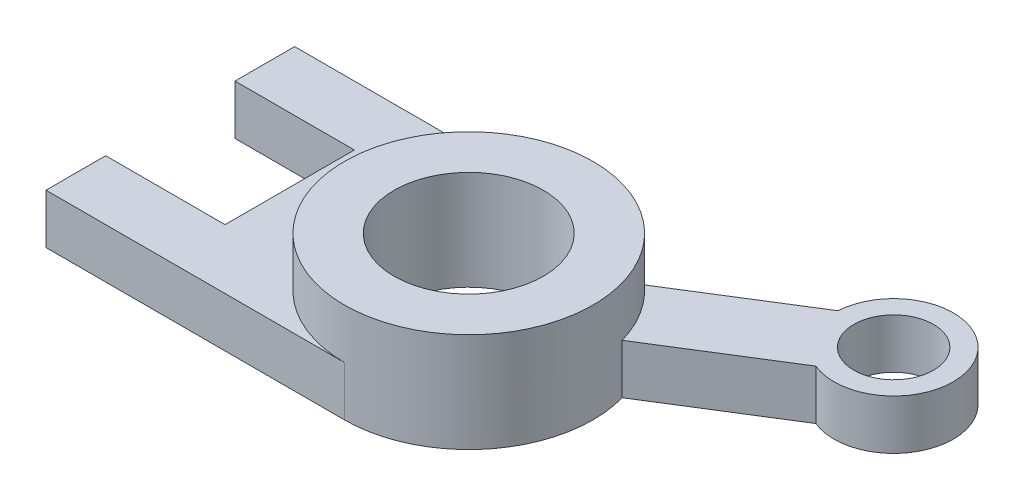
ISO-10303-21;
HEADER;
FILE_DESCRIPTION(('STEP AP214'),'2;1');
FILE_NAME('part.step','',(''),(''),'','','');
FILE_SCHEMA(('AUTOMOTIVE_DESIGN { 1 0 10303 214 1 1 1 1 }'));
ENDSEC;
DATA;
#1=APPLICATION_CONTEXT('core data for automotive mechanical design processes');
#2=APPLICATION_PROTOCOL_DEFINITION('international standard','automotive_design',2000,#1);
#3=PRODUCT_CONTEXT('',#1,'mechanical');
#4=PRODUCT('Part','Part','',(#3));
#5=PRODUCT_RELATED_PRODUCT_CATEGORY('part','',(#4));
#6=PRODUCT_DEFINITION_FORMATION('','',#4);
#7=PRODUCT_DEFINITION_CONTEXT('part definition',#1,'design');
#8=PRODUCT_DEFINITION('design','',#6,#7);
#9=PRODUCT_DEFINITION_SHAPE('','',#8);
#10=(LENGTH_UNIT() NAMED_UNIT(*) SI_UNIT(.MILLI.,.METRE.));
#11=(NAMED_UNIT(*) PLANE_ANGLE_UNIT() SI_UNIT($,.RADIAN.));
#12=(NAMED_UNIT(*) SI_UNIT($,.STERADIAN.) SOLID_ANGLE_UNIT());
#13=UNCERTAINTY_MEASURE_WITH_UNIT(LENGTH_MEASURE(1.E-05),#10,'distance_accuracy_value','');
#14=(GEOMETRIC_REPRESENTATION_CONTEXT(3) GLOBAL_UNCERTAINTY_ASSIGNED_CONTEXT((#13)) GLOBAL_UNIT_ASSIGNED_CONTEXT((#10,
#11,#12)) REPRESENTATION_CONTEXT('',''));
#15=CARTESIAN_POINT('',(0.,0.,0.));
#16=DIRECTION('',(0.,0.,1.));
#17=DIRECTION('',(1.,0.,0.));
#18=AXIS2_PLACEMENT_3D('',#15,#16,#17);
#19=CARTESIAN_POINT('',(0.,5.,0.));
#20=DIRECTION('',(0.,1.,0.));
#21=DIRECTION('',(0.,0.,1.));
#22=AXIS2_PLACEMENT_3D('',#19,#20,#21);
#23=PLANE('',#22);
#24=CARTESIAN_POINT('',(0.,5.,0.));
#25=DIRECTION('',(0.,1.,0.));
#26=DIRECTION('',(0.,0.,1.));
#27=AXIS2_PLACEMENT_3D('',#24,#25,#26);
#28=CIRCLE('',#27,12.4999999999972);
#29=CARTESIAN_POINT('',(12.0312945786778,5.,-3.39086283426413));
#30=VERTEX_POINT('',#29);
#31=CARTESIAN_POINT('',(8.32185972905463,5.,-9.32719950734393));
#32=VERTEX_POINT('',#31);
#33=EDGE_CURVE('E11',#30,#32,#28,.T.);
#34=ORIENTED_EDGE('',*,*,#33,.F.);
#35=DIRECTION('',(0.84804809615557,0.,-0.529919264234575));
#36=VECTOR('',#35,1.);
#37=CARTESIAN_POINT('',(12.0312945786778,5.,-3.39086283426413));
#38=LINE('',#37,#36);
#39=CARTESIAN_POINT('',(24.0113332117606,5.,-10.8768218107942));
#40=VERTEX_POINT('',#39);
#41=EDGE_CURVE('E211',#30,#40,#38,.T.);
#42=ORIENTED_EDGE('',*,*,#41,.T.);
#43=CARTESIAN_POINT('',(26.289490980841,5.,-16.4274971912538));
#44=DIRECTION('',(0.,1.,0.));
#45=DIRECTION('',(0.,0.,1.));
#46=AXIS2_PLACEMENT_3D('',#43,#44,#45);
#47=CIRCLE('',#46,6.00000000000514);
#48=CARTESIAN_POINT('',(20.3018983621457,5.,-16.8131584838504));
#49=VERTEX_POINT('',#48);
#50=EDGE_CURVE('E268',#40,#49,#47,.T.);
#51=ORIENTED_EDGE('',*,*,#50,.T.);
#52=DIRECTION('',(-0.848048096156426,0.,0.529919264233206));
#53=VECTOR('',#52,1.);
#54=CARTESIAN_POINT('',(8.32185972905084,5.,-9.32719950733968));
#55=LINE('',#54,#53);
#56=EDGE_CURVE('E271',#49,#32,#55,.T.);
#57=ORIENTED_EDGE('',*,*,#56,.T.);
#58=EDGE_LOOP('',(#34,#42,#51,#57));
#59=FACE_BOUND('',#58,.T.);
#60=CARTESIAN_POINT('',(26.2894909808363,5.,-16.4274971912541));
#61=DIRECTION('',(0.,1.,0.));
#62=DIRECTION('',(0.,0.,1.));
#63=AXIS2_PLACEMENT_3D('',#60,#61,#62);
#64=CIRCLE('',#63,4.00000000000514);
#65=CARTESIAN_POINT('',(26.2894909808363,5.,-12.427497191249));
#66=VERTEX_POINT('',#65);
#67=EDGE_CURVE('E181',#66,#66,#64,.T.);
#68=ORIENTED_EDGE('',*,*,#67,.F.);
#69=EDGE_LOOP('',(#68));
#70=FACE_BOUND('',#69,.T.);
#71=ADVANCED_FACE('F43',(#59,#70),#23,.T.);
#72=CARTESIAN_POINT('',(12.0312945786778,5.,-3.39086283426413));
#73=DIRECTION('',(-0.529919264234575,0.,-0.848048096155569));
#74=DIRECTION('',(-0.84804809615557,0.,0.529919264234576));
#75=AXIS2_PLACEMENT_3D('',#72,#73,#74);
#76=PLANE('',#75);
#77=DIRECTION('',(0.84804809615557,0.,-0.529919264234575));
#78=VECTOR('',#77,1.);
#79=CARTESIAN_POINT('',(12.0312945786778,0.,-3.39086283426413));
#80=LINE('',#79,#78);
#81=CARTESIAN_POINT('',(12.0312945786778,0.,-3.39086283426413));
#82=VERTEX_POINT('',#81);
#83=CARTESIAN_POINT('',(24.0113332117606,0.,-10.8768218107942));
#84=VERTEX_POINT('',#83);
#85=EDGE_CURVE('E180',#82,#84,#80,.T.);
#86=ORIENTED_EDGE('',*,*,#85,.T.);
#87=DIRECTION('',(0.,-1.,0.));
#88=VECTOR('',#87,1.);
#89=CARTESIAN_POINT('',(24.0113332117606,5.,-10.8768218107942));
#90=LINE('',#89,#88);
#91=EDGE_CURVE('E240',#40,#84,#90,.T.);
#92=ORIENTED_EDGE('',*,*,#91,.F.);
#93=ORIENTED_EDGE('',*,*,#41,.F.);
#94=DIRECTION('',(0.,-1.,0.));
#95=VECTOR('',#94,1.);
#96=CARTESIAN_POINT('',(12.0312945786778,5.,-3.39086283426413));
#97=LINE('',#96,#95);
#98=EDGE_CURVE('E47',#30,#82,#97,.T.);
#99=ORIENTED_EDGE('',*,*,#98,.T.);
#100=EDGE_LOOP('',(#86,#92,#93,#99));
#101=FACE_BOUND('',#100,.T.);
#102=ADVANCED_FACE('F45',(#101),#76,.F.);
#103=CARTESIAN_POINT('',(26.289490980841,5.,-16.4274971912538));
#104=DIRECTION('',(0.,-1.,0.));
#105=DIRECTION('',(0.,0.,-1.));
#106=AXIS2_PLACEMENT_3D('',#103,#104,#105);
#107=CYLINDRICAL_SURFACE('',#106,6.00000000000514);
#108=CARTESIAN_POINT('',(26.289490980841,0.,-16.4274971912538));
#109=DIRECTION('',(0.,1.,0.));
#110=DIRECTION('',(0.,0.,1.));
#111=AXIS2_PLACEMENT_3D('',#108,#109,#110);
#112=CIRCLE('',#111,6.00000000000514);
#113=CARTESIAN_POINT('',(20.3018983621457,0.,-16.8131584838504));
#114=VERTEX_POINT('',#113);
#115=EDGE_CURVE('E184',#84,#114,#112,.T.);
#116=ORIENTED_EDGE('',*,*,#115,.T.);
#117=DIRECTION('',(0.,-1.,0.));
#118=VECTOR('',#117,1.);
#119=CARTESIAN_POINT('',(20.3018983621457,5.,-16.8131584838504));
#120=LINE('',#119,#118);
#121=EDGE_CURVE('E237',#49,#114,#120,.T.);
#122=ORIENTED_EDGE('',*,*,#121,.F.);
#123=ORIENTED_EDGE('',*,*,#50,.F.);
#124=ORIENTED_EDGE('',*,*,#91,.T.);
#125=EDGE_LOOP('',(#116,#122,#123,#124));
#126=FACE_BOUND('',#125,.T.);
#127=ADVANCED_FACE('F312',(#126),#107,.T.);
#128=CARTESIAN_POINT('',(8.32185972905084,5.,-9.32719950733968));
#129=DIRECTION('',(0.529919264233206,0.,0.848048096156426));
#130=DIRECTION('',(0.848048096156426,0.,-0.529919264233206));
#131=AXIS2_PLACEMENT_3D('',#128,#129,#130);
#132=PLANE('',#131);
#133=DIRECTION('',(-0.848048096156426,0.,0.529919264233206));
#134=VECTOR('',#133,1.);
#135=CARTESIAN_POINT('',(8.32185972905084,0.,-9.32719950733968));
#136=LINE('',#135,#134);
#137=CARTESIAN_POINT('',(8.32185972905463,0.,-9.32719950734393));
#138=VERTEX_POINT('',#137);
#139=EDGE_CURVE('E187',#114,#138,#136,.T.);
#140=ORIENTED_EDGE('',*,*,#139,.T.);
#141=DIRECTION('',(0.,-1.,0.));
#142=VECTOR('',#141,1.);
#143=CARTESIAN_POINT('',(8.32185972905463,5.,-9.32719950734393));
#144=LINE('',#143,#142);
#145=EDGE_CURVE('E233',#32,#138,#144,.T.);
#146=ORIENTED_EDGE('',*,*,#145,.F.);
#147=ORIENTED_EDGE('',*,*,#56,.F.);
#148=ORIENTED_EDGE('',*,*,#121,.T.);
#149=EDGE_LOOP('',(#140,#146,#147,#148));
#150=FACE_BOUND('',#149,.T.);
#151=ADVANCED_FACE('F303',(#150),#132,.F.);
#152=CARTESIAN_POINT('',(0.,5.,0.));
#153=DIRECTION('',(0.,-1.,0.));
#154=DIRECTION('',(0.,0.,-1.));
#155=AXIS2_PLACEMENT_3D('',#152,#153,#154);
#156=CYLINDRICAL_SURFACE('',#155,12.4999999999943);
#157=CARTESIAN_POINT('',(0.,0.,0.));
#158=DIRECTION('',(0.,1.,0.));
#159=DIRECTION('',(0.,0.,1.));
#160=AXIS2_PLACEMENT_3D('',#157,#158,#159);
#161=CIRCLE('',#160,12.4999999999943);
#162=CARTESIAN_POINT('',(2.45031457129725E-11,0.,-12.5));
#163=VERTEX_POINT('',#162);
#164=EDGE_CURVE('E190',#138,#163,#161,.T.);
#165=ORIENTED_EDGE('',*,*,#164,.T.);
#166=DIRECTION('',(0.,-1.,0.));
#167=VECTOR('',#166,1.);
#168=CARTESIAN_POINT('',(2.45031457129725E-11,5.,-12.5));
#169=LINE('',#168,#167);
#170=CARTESIAN_POINT('',(2.45031457129725E-11,5.,-12.5));
#171=VERTEX_POINT('',#170);
#172=EDGE_CURVE('E229',#171,#163,#169,.T.);
#173=ORIENTED_EDGE('',*,*,#172,.F.);
#174=CARTESIAN_POINT('',(0.,5.,12.4999999999972));
#175=VERTEX_POINT('',#174);
#176=EDGE_CURVE('E54',#171,#175,#28,.T.);
#177=ORIENTED_EDGE('',*,*,#176,.T.);
#178=DIRECTION('',(0.,-1.,0.));
#179=VECTOR('',#178,1.);
#180=CARTESIAN_POINT('',(2.45030503125081E-11,5.,12.4999999999886));
#181=LINE('',#180,#179);
#182=CARTESIAN_POINT('',(2.45030503125081E-11,0.,12.4999999999886));
#183=VERTEX_POINT('',#182);
#184=EDGE_CURVE('E175',#175,#183,#181,.T.);
#185=ORIENTED_EDGE('',*,*,#184,.T.);
#186=CARTESIAN_POINT('',(0.,0.,0.));
#187=DIRECTION('',(0.,1.,0.));
#188=DIRECTION('',(0.,0.,1.));
#189=AXIS2_PLACEMENT_3D('',#186,#187,#188);
#190=CIRCLE('',#189,12.4999999999886);
#191=EDGE_CURVE('E176',#183,#82,#190,.T.);
#192=ORIENTED_EDGE('',*,*,#191,.T.);
#193=ORIENTED_EDGE('',*,*,#98,.F.);
#194=ORIENTED_EDGE('',*,*,#33,.T.);
#195=ORIENTED_EDGE('',*,*,#145,.T.);
#196=EDGE_LOOP('',(#165,#173,#177,#185,#192,#193,#194,#195));
#197=FACE_BOUND('',#196,.T.);
#198=CARTESIAN_POINT('',(0.,10.,0.));
#199=DIRECTION('',(0.,1.,0.));
#200=DIRECTION('',(0.,0.,1.));
#201=AXIS2_PLACEMENT_3D('',#198,#199,#200);
#202=CIRCLE('',#201,12.4999999999972);
#203=CARTESIAN_POINT('',(0.,10.,12.4999999999972));
#204=VERTEX_POINT('',#203);
#205=EDGE_CURVE('E257',#204,#204,#202,.T.);
#206=ORIENTED_EDGE('',*,*,#205,.F.);
#207=EDGE_LOOP('',(#206));
#208=FACE_BOUND('',#207,.T.);
#209=ADVANCED_FACE('F300',(#197,#208),#156,.T.);
#210=CARTESIAN_POINT('',(2.45031457129725E-11,5.,-12.5));
#211=DIRECTION('',(0.,0.,1.));
#212=DIRECTION('',(1.,0.,0.));
#213=AXIS2_PLACEMENT_3D('',#210,#211,#212);
#214=PLANE('',#213);
#215=DIRECTION('',(-1.,0.,0.));
#216=VECTOR('',#215,1.);
#217=CARTESIAN_POINT('',(2.45031457129725E-11,0.,-12.5));
#218=LINE('',#217,#216);
#219=CARTESIAN_POINT('',(-29.9999999999755,0.,-12.5));
#220=VERTEX_POINT('',#219);
#221=EDGE_CURVE('E193',#163,#220,#218,.T.);
#222=ORIENTED_EDGE('',*,*,#221,.T.);
#223=DIRECTION('',(0.,-1.,0.));
#224=VECTOR('',#223,1.);
#225=CARTESIAN_POINT('',(-29.9999999999755,5.,-12.5));
#226=LINE('',#225,#224);
#227=CARTESIAN_POINT('',(-29.9999999999755,5.,-12.5));
#228=VERTEX_POINT('',#227);
#229=EDGE_CURVE('E225',#228,#220,#226,.T.);
#230=ORIENTED_EDGE('',*,*,#229,.F.);
#231=DIRECTION('',(-1.,0.,0.));
#232=VECTOR('',#231,1.);
#233=CARTESIAN_POINT('',(2.45031457129725E-11,5.,-12.5));
#234=LINE('',#233,#232);
#235=EDGE_CURVE('E274',#171,#228,#234,.T.);
#236=ORIENTED_EDGE('',*,*,#235,.F.);
#237=ORIENTED_EDGE('',*,*,#172,.T.);
#238=EDGE_LOOP('',(#222,#230,#236,#237));
#239=FACE_BOUND('',#238,.T.);
#240=ADVANCED_FACE('F302',(#239),#214,.F.);
#241=CARTESIAN_POINT('',(-29.9999999999755,5.,-6.5));
#242=DIRECTION('',(1.,0.,0.));
#243=DIRECTION('',(0.,0.,-1.));
#244=AXIS2_PLACEMENT_3D('',#241,#242,#243);
#245=PLANE('',#244);
#246=DIRECTION('',(0.,0.,1.));
#247=VECTOR('',#246,1.);
#248=CARTESIAN_POINT('',(-29.9999999999755,0.,-6.5));
#249=LINE('',#248,#247);
#250=CARTESIAN_POINT('',(-29.9999999999755,0.,-6.5));
#251=VERTEX_POINT('',#250);
#252=EDGE_CURVE('E196',#220,#251,#249,.T.);
#253=ORIENTED_EDGE('',*,*,#252,.T.);
#254=DIRECTION('',(0.,-1.,0.));
#255=VECTOR('',#254,1.);
#256=CARTESIAN_POINT('',(-29.9999999999755,5.,-6.5));
#257=LINE('',#256,#255);
#258=CARTESIAN_POINT('',(-29.9999999999755,5.,-6.5));
#259=VERTEX_POINT('',#258);
#260=EDGE_CURVE('E221',#259,#251,#257,.T.);
#261=ORIENTED_EDGE('',*,*,#260,.F.);
#262=DIRECTION('',(0.,0.,1.));
#263=VECTOR('',#262,1.);
#264=CARTESIAN_POINT('',(-29.9999999999755,5.,-6.5));
#265=LINE('',#264,#263);
#266=EDGE_CURVE('E277',#228,#259,#265,.T.);
#267=ORIENTED_EDGE('',*,*,#266,.F.);
#268=ORIENTED_EDGE('',*,*,#229,.T.);
#269=EDGE_LOOP('',(#253,#261,#267,#268));
#270=FACE_BOUND('',#269,.T.);
#271=ADVANCED_FACE('F309',(#270),#245,.F.);
#272=CARTESIAN_POINT('',(-29.9999999999755,5.,-6.5));
#273=DIRECTION('',(0.,0.,-1.));
#274=DIRECTION('',(-1.,0.,0.));
#275=AXIS2_PLACEMENT_3D('',#272,#273,#274);
#276=PLANE('',#275);
#277=DIRECTION('',(1.,0.,0.));
#278=VECTOR('',#277,1.);
#279=CARTESIAN_POINT('',(-29.9999999999755,0.,-6.5));
#280=LINE('',#279,#278);
#281=CARTESIAN_POINT('',(-17.9999999999755,0.,-6.5));
#282=VERTEX_POINT('',#281);
#283=EDGE_CURVE('E199',#251,#282,#280,.T.);
#284=ORIENTED_EDGE('',*,*,#283,.T.);
#285=DIRECTION('',(0.,-1.,0.));
#286=VECTOR('',#285,1.);
#287=CARTESIAN_POINT('',(-17.9999999999755,5.,-6.5));
#288=LINE('',#287,#286);
#289=CARTESIAN_POINT('',(-17.9999999999755,5.,-6.5));
#290=VERTEX_POINT('',#289);
#291=EDGE_CURVE('E162',#290,#282,#288,.T.);
#292=ORIENTED_EDGE('',*,*,#291,.F.);
#293=DIRECTION('',(1.,0.,0.));
#294=VECTOR('',#293,1.);
#295=CARTESIAN_POINT('',(-29.9999999999755,5.,-6.5));
#296=LINE('',#295,#294);
#297=EDGE_CURVE('E148',#259,#290,#296,.T.);
#298=ORIENTED_EDGE('',*,*,#297,.F.);
#299=ORIENTED_EDGE('',*,*,#260,.T.);
#300=EDGE_LOOP('',(#284,#292,#298,#299));
#301=FACE_BOUND('',#300,.T.);
#302=ADVANCED_FACE('F342',(#301),#276,.F.);
#303=CARTESIAN_POINT('',(-17.9999999999755,5.,-6.5));
#304=DIRECTION('',(1.,0.,0.));
#305=DIRECTION('',(0.,0.,-1.));
#306=AXIS2_PLACEMENT_3D('',#303,#304,#305);
#307=PLANE('',#306);
#308=DIRECTION('',(0.,0.,1.));
#309=VECTOR('',#308,1.);
#310=CARTESIAN_POINT('',(-17.9999999999755,0.,-6.5));
#311=LINE('',#310,#309);
#312=CARTESIAN_POINT('',(-17.9999999999755,0.,6.5));
#313=VERTEX_POINT('',#312);
#314=EDGE_CURVE('E158',#282,#313,#311,.T.);
#315=ORIENTED_EDGE('',*,*,#314,.T.);
#316=DIRECTION('',(0.,-1.,0.));
#317=VECTOR('',#316,1.);
#318=CARTESIAN_POINT('',(-17.9999999999755,5.,6.5));
#319=LINE('',#318,#317);
#320=CARTESIAN_POINT('',(-17.9999999999755,5.,6.5));
#321=VERTEX_POINT('',#320);
#322=EDGE_CURVE('E155',#321,#313,#319,.T.);
#323=ORIENTED_EDGE('',*,*,#322,.F.);
#324=DIRECTION('',(0.,0.,1.));
#325=VECTOR('',#324,1.);
#326=CARTESIAN_POINT('',(-17.9999999999755,5.,-6.5));
#327=LINE('',#326,#325);
#328=EDGE_CURVE('E141',#290,#321,#327,.T.);
#329=ORIENTED_EDGE('',*,*,#328,.F.);
#330=ORIENTED_EDGE('',*,*,#291,.T.);
#331=EDGE_LOOP('',(#315,#323,#329,#330));
#332=FACE_BOUND('',#331,.T.);
#333=ADVANCED_FACE('F156',(#332),#307,.F.);
#334=CARTESIAN_POINT('',(-29.9999999999755,5.,6.5));
#335=DIRECTION('',(0.,0.,1.));
#336=DIRECTION('',(1.,0.,0.));
#337=AXIS2_PLACEMENT_3D('',#334,#335,#336);
#338=PLANE('',#337);
#339=DIRECTION('',(-1.,0.,0.));
#340=VECTOR('',#339,1.);
#341=CARTESIAN_POINT('',(-29.9999999999755,0.,6.5));
#342=LINE('',#341,#340);
#343=CARTESIAN_POINT('',(-29.9999999999755,0.,6.5));
#344=VERTEX_POINT('',#343);
#345=EDGE_CURVE('E204',#313,#344,#342,.T.);
#346=ORIENTED_EDGE('',*,*,#345,.T.);
#347=DIRECTION('',(0.,-1.,0.));
#348=VECTOR('',#347,1.);
#349=CARTESIAN_POINT('',(-29.9999999999755,5.,6.5));
#350=LINE('',#349,#348);
#351=CARTESIAN_POINT('',(-29.9999999999755,5.,6.5));
#352=VERTEX_POINT('',#351);
#353=EDGE_CURVE('E163',#352,#344,#350,.T.);
#354=ORIENTED_EDGE('',*,*,#353,.F.);
#355=DIRECTION('',(-1.,0.,0.));
#356=VECTOR('',#355,1.);
#357=CARTESIAN_POINT('',(-29.9999999999755,5.,6.5));
#358=LINE('',#357,#356);
#359=EDGE_CURVE('E145',#321,#352,#358,.T.);
#360=ORIENTED_EDGE('',*,*,#359,.F.);
#361=ORIENTED_EDGE('',*,*,#322,.T.);
#362=EDGE_LOOP('',(#346,#354,#360,#361));
#363=FACE_BOUND('',#362,.T.);
#364=ADVANCED_FACE('F165',(#363),#338,.F.);
#365=CARTESIAN_POINT('',(-29.9999999999755,5.,12.5));
#366=DIRECTION('',(1.,0.,0.));
#367=DIRECTION('',(0.,0.,-1.));
#368=AXIS2_PLACEMENT_3D('',#365,#366,#367);
#369=PLANE('',#368);
#370=DIRECTION('',(0.,0.,1.));
#371=VECTOR('',#370,1.);
#372=CARTESIAN_POINT('',(-29.9999999999755,0.,12.5));
#373=LINE('',#372,#371);
#374=CARTESIAN_POINT('',(-29.9999999999755,0.,12.5));
#375=VERTEX_POINT('',#374);
#376=EDGE_CURVE('E104',#344,#375,#373,.T.);
#377=ORIENTED_EDGE('',*,*,#376,.T.);
#378=DIRECTION('',(0.,-1.,0.));
#379=VECTOR('',#378,1.);
#380=CARTESIAN_POINT('',(-29.9999999999755,5.,12.5));
#381=LINE('',#380,#379);
#382=CARTESIAN_POINT('',(-29.9999999999755,5.,12.5));
#383=VERTEX_POINT('',#382);
#384=EDGE_CURVE('E214',#383,#375,#381,.T.);
#385=ORIENTED_EDGE('',*,*,#384,.F.);
#386=DIRECTION('',(0.,0.,1.));
#387=VECTOR('',#386,1.);
#388=CARTESIAN_POINT('',(-29.9999999999755,5.,12.5));
#389=LINE('',#388,#387);
#390=EDGE_CURVE('E63',#352,#383,#389,.T.);
#391=ORIENTED_EDGE('',*,*,#390,.F.);
#392=ORIENTED_EDGE('',*,*,#353,.T.);
#393=EDGE_LOOP('',(#377,#385,#391,#392));
#394=FACE_BOUND('',#393,.T.);
#395=ADVANCED_FACE('F331',(#394),#369,.F.);
#396=CARTESIAN_POINT('',(2.45030503125081E-11,5.,12.4999999999886));
#397=DIRECTION('',(-3.79094903616798E-13,0.,-1.));
#398=DIRECTION('',(-1.,0.,3.79094903616798E-13));
#399=AXIS2_PLACEMENT_3D('',#396,#397,#398);
#400=PLANE('',#399);
#401=DIRECTION('',(1.,0.,-3.79094903616798E-13));
#402=VECTOR('',#401,1.);
#403=CARTESIAN_POINT('',(2.45030503125081E-11,0.,12.4999999999886));
#404=LINE('',#403,#402);
#405=EDGE_CURVE('E111',#375,#183,#404,.T.);
#406=ORIENTED_EDGE('',*,*,#405,.T.);
#407=ORIENTED_EDGE('',*,*,#184,.F.);
#408=DIRECTION('',(1.,0.,-3.79094903616798E-13));
#409=VECTOR('',#408,1.);
#410=CARTESIAN_POINT('',(2.45030503125081E-11,5.,12.4999999999886));
#411=LINE('',#410,#409);
#412=EDGE_CURVE('E169',#383,#175,#411,.T.);
#413=ORIENTED_EDGE('',*,*,#412,.F.);
#414=ORIENTED_EDGE('',*,*,#384,.T.);
#415=EDGE_LOOP('',(#406,#407,#413,#414));
#416=FACE_BOUND('',#415,.T.);
#417=ADVANCED_FACE('F325',(#416),#400,.F.);
#418=ORIENTED_EDGE('',*,*,#176,.F.);
#419=ORIENTED_EDGE('',*,*,#235,.T.);
#420=ORIENTED_EDGE('',*,*,#266,.T.);
#421=ORIENTED_EDGE('',*,*,#297,.T.);
#422=ORIENTED_EDGE('',*,*,#328,.T.);
#423=ORIENTED_EDGE('',*,*,#359,.T.);
#424=ORIENTED_EDGE('',*,*,#390,.T.);
#425=ORIENTED_EDGE('',*,*,#412,.T.);
#426=EDGE_LOOP('',(#418,#419,#420,#421,#422,#423,#424,#425));
#427=FACE_BOUND('',#426,.T.);
#428=ADVANCED_FACE('F143',(#427),#23,.T.);
#429=CARTESIAN_POINT('',(0.,0.,0.));
#430=DIRECTION('',(0.,1.,0.));
#431=DIRECTION('',(0.,0.,1.));
#432=AXIS2_PLACEMENT_3D('',#429,#430,#431);
#433=PLANE('',#432);
#434=CARTESIAN_POINT('',(0.,0.,0.));
#435=DIRECTION('',(0.,1.,0.));
#436=DIRECTION('',(0.,0.,1.));
#437=AXIS2_PLACEMENT_3D('',#434,#435,#436);
#438=CIRCLE('',#437,7.5);
#439=CARTESIAN_POINT('',(0.,0.,7.5));
#440=VERTEX_POINT('',#439);
#441=EDGE_CURVE('E283',#440,#440,#438,.T.);
#442=ORIENTED_EDGE('',*,*,#441,.T.);
#443=EDGE_LOOP('',(#442));
#444=FACE_BOUND('',#443,.T.);
#445=CARTESIAN_POINT('',(26.2894909808363,0.,-16.4274971912541));
#446=DIRECTION('',(0.,1.,0.));
#447=DIRECTION('',(0.,0.,1.));
#448=AXIS2_PLACEMENT_3D('',#445,#446,#447);
#449=CIRCLE('',#448,4.00000000000514);
#450=CARTESIAN_POINT('',(26.2894909808363,0.,-12.427497191249));
#451=VERTEX_POINT('',#450);
#452=EDGE_CURVE('E262',#451,#451,#449,.T.);
#453=ORIENTED_EDGE('',*,*,#452,.T.);
#454=EDGE_LOOP('',(#453));
#455=FACE_BOUND('',#454,.T.);
#456=ORIENTED_EDGE('',*,*,#191,.F.);
#457=ORIENTED_EDGE('',*,*,#405,.F.);
#458=ORIENTED_EDGE('',*,*,#376,.F.);
#459=ORIENTED_EDGE('',*,*,#345,.F.);
#460=ORIENTED_EDGE('',*,*,#314,.F.);
#461=ORIENTED_EDGE('',*,*,#283,.F.);
#462=ORIENTED_EDGE('',*,*,#252,.F.);
#463=ORIENTED_EDGE('',*,*,#221,.F.);
#464=ORIENTED_EDGE('',*,*,#164,.F.);
#465=ORIENTED_EDGE('',*,*,#139,.F.);
#466=ORIENTED_EDGE('',*,*,#115,.F.);
#467=ORIENTED_EDGE('',*,*,#85,.F.);
#468=EDGE_LOOP('',(#456,#457,#458,#459,#460,#461,#462,#463,#464,#465,#466,#467));
#469=FACE_BOUND('',#468,.T.);
#470=ADVANCED_FACE('F324',(#444,#455,#469),#433,.F.);
#471=CARTESIAN_POINT('',(26.2894909808363,5.,-16.4274971912541));
#472=DIRECTION('',(0.,-1.,0.));
#473=DIRECTION('',(0.,0.,-1.));
#474=AXIS2_PLACEMENT_3D('',#471,#472,#473);
#475=CYLINDRICAL_SURFACE('',#474,4.00000000000514);
#476=ORIENTED_EDGE('',*,*,#67,.T.);
#477=EDGE_LOOP('',(#476));
#478=FACE_BOUND('',#477,.T.);
#479=ORIENTED_EDGE('',*,*,#452,.F.);
#480=EDGE_LOOP('',(#479));
#481=FACE_BOUND('',#480,.T.);
#482=ADVANCED_FACE('F296',(#478,#481),#475,.F.);
#483=CARTESIAN_POINT('',(0.,10.,0.));
#484=DIRECTION('',(0.,1.,0.));
#485=DIRECTION('',(0.,0.,1.));
#486=AXIS2_PLACEMENT_3D('',#483,#484,#485);
#487=PLANE('',#486);
#488=CARTESIAN_POINT('',(0.,10.,0.));
#489=DIRECTION('',(0.,1.,0.));
#490=DIRECTION('',(0.,0.,1.));
#491=AXIS2_PLACEMENT_3D('',#488,#489,#490);
#492=CIRCLE('',#491,7.5);
#493=CARTESIAN_POINT('',(0.,10.,7.5));
#494=VERTEX_POINT('',#493);
#495=EDGE_CURVE('E286',#494,#494,#492,.T.);
#496=ORIENTED_EDGE('',*,*,#495,.F.);
#497=EDGE_LOOP('',(#496));
#498=FACE_BOUND('',#497,.T.);
#499=ORIENTED_EDGE('',*,*,#205,.T.);
#500=EDGE_LOOP('',(#499));
#501=FACE_BOUND('',#500,.T.);
#502=ADVANCED_FACE('F293',(#498,#501),#487,.T.);
#503=CARTESIAN_POINT('',(0.,0.,0.));
#504=DIRECTION('',(0.,1.,0.));
#505=DIRECTION('',(0.,0.,1.));
#506=AXIS2_PLACEMENT_3D('',#503,#504,#505);
#507=CYLINDRICAL_SURFACE('',#506,7.5);
#508=ORIENTED_EDGE('',*,*,#441,.F.);
#509=EDGE_LOOP('',(#508));
#510=FACE_BOUND('',#509,.T.);
#511=ORIENTED_EDGE('',*,*,#495,.T.);
#512=EDGE_LOOP('',(#511));
#513=FACE_BOUND('',#512,.T.);
#514=ADVANCED_FACE('F291',(#510,#513),#507,.F.);
#515=CLOSED_SHELL('',(#71,#102,#127,#151,#209,#240,#271,#302,#333,#364,#395,#417,#428,#470,#482,
#502,#514));
#516=MANIFOLD_SOLID_BREP('B2',#515);
#517=ADVANCED_BREP_SHAPE_REPRESENTATION('',(#18,#516),#14);
#518=SHAPE_DEFINITION_REPRESENTATION(#9,#517);
ENDSEC;
END-ISO-10303-21;
